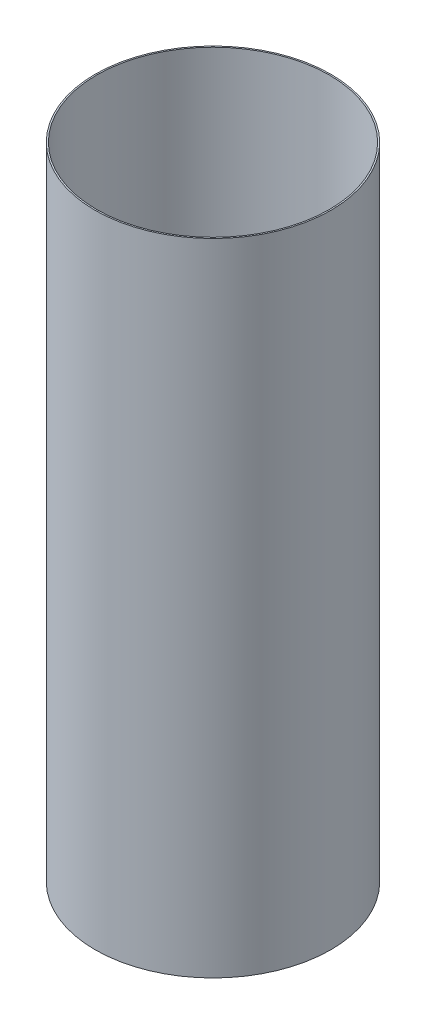
ISO-10303-21;
HEADER;
FILE_DESCRIPTION(('STEP AP214'),'2;1');
FILE_NAME('part.step','',(''),(''),'','','');
FILE_SCHEMA(('AUTOMOTIVE_DESIGN { 1 0 10303 214 1 1 1 1 }'));
ENDSEC;
DATA;
#1=APPLICATION_CONTEXT('core data for automotive mechanical design processes');
#2=APPLICATION_PROTOCOL_DEFINITION('international standard','automotive_design',2000,#1);
#3=PRODUCT_CONTEXT('',#1,'mechanical');
#4=PRODUCT('Part','Part','',(#3));
#5=PRODUCT_RELATED_PRODUCT_CATEGORY('part','',(#4));
#6=PRODUCT_DEFINITION_FORMATION('','',#4);
#7=PRODUCT_DEFINITION_CONTEXT('part definition',#1,'design');
#8=PRODUCT_DEFINITION('design','',#6,#7);
#9=PRODUCT_DEFINITION_SHAPE('','',#8);
#10=(LENGTH_UNIT() NAMED_UNIT(*) SI_UNIT(.MILLI.,.METRE.));
#11=(NAMED_UNIT(*) PLANE_ANGLE_UNIT() SI_UNIT($,.RADIAN.));
#12=(NAMED_UNIT(*) SI_UNIT($,.STERADIAN.) SOLID_ANGLE_UNIT());
#13=UNCERTAINTY_MEASURE_WITH_UNIT(LENGTH_MEASURE(1.E-05),#10,'distance_accuracy_value','');
#14=(GEOMETRIC_REPRESENTATION_CONTEXT(3) GLOBAL_UNCERTAINTY_ASSIGNED_CONTEXT((#13)) GLOBAL_UNIT_ASSIGNED_CONTEXT((#10,
#11,#12)) REPRESENTATION_CONTEXT('',''));
#15=CARTESIAN_POINT('',(0.,0.,0.));
#16=DIRECTION('',(0.,0.,1.));
#17=DIRECTION('',(1.,0.,0.));
#18=AXIS2_PLACEMENT_3D('',#15,#16,#17);
#19=CARTESIAN_POINT('',(0.,22000.,0.));
#20=DIRECTION('',(0.,1.,0.));
#21=DIRECTION('',(0.,0.,1.));
#22=AXIS2_PLACEMENT_3D('',#19,#20,#21);
#23=PLANE('',#22);
#24=CARTESIAN_POINT('',(0.,22000.,0.));
#25=DIRECTION('',(0.,1.,0.));
#26=DIRECTION('',(0.,0.,1.));
#27=AXIS2_PLACEMENT_3D('',#24,#25,#26);
#28=CIRCLE('',#27,4050.);
#29=CARTESIAN_POINT('',(0.,22000.,4050.));
#30=VERTEX_POINT('',#29);
#31=EDGE_CURVE('E10',#30,#30,#28,.T.);
#32=ORIENTED_EDGE('',*,*,#31,.T.);
#33=EDGE_LOOP('',(#32));
#34=FACE_BOUND('',#33,.T.);
#35=CARTESIAN_POINT('',(0.,22000.,0.));
#36=DIRECTION('',(0.,1.,0.));
#37=DIRECTION('',(0.,0.,1.));
#38=AXIS2_PLACEMENT_3D('',#35,#36,#37);
#39=CIRCLE('',#38,4000.);
#40=CARTESIAN_POINT('',(0.,22000.,4000.));
#41=VERTEX_POINT('',#40);
#42=EDGE_CURVE('E48',#41,#41,#39,.T.);
#43=ORIENTED_EDGE('',*,*,#42,.F.);
#44=EDGE_LOOP('',(#43));
#45=FACE_BOUND('',#44,.T.);
#46=ADVANCED_FACE('F40',(#34,#45),#23,.T.);
#47=CARTESIAN_POINT('',(0.,0.,0.));
#48=DIRECTION('',(0.,1.,0.));
#49=DIRECTION('',(0.,0.,1.));
#50=AXIS2_PLACEMENT_3D('',#47,#48,#49);
#51=PLANE('',#50);
#52=CARTESIAN_POINT('',(0.,0.,0.));
#53=DIRECTION('',(0.,1.,0.));
#54=DIRECTION('',(0.,0.,1.));
#55=AXIS2_PLACEMENT_3D('',#52,#53,#54);
#56=CIRCLE('',#55,4050.);
#57=CARTESIAN_POINT('',(0.,0.,4050.));
#58=VERTEX_POINT('',#57);
#59=EDGE_CURVE('E41',#58,#58,#56,.T.);
#60=ORIENTED_EDGE('',*,*,#59,.F.);
#61=EDGE_LOOP('',(#60));
#62=FACE_BOUND('',#61,.T.);
#63=CARTESIAN_POINT('',(0.,0.,0.));
#64=DIRECTION('',(0.,1.,0.));
#65=DIRECTION('',(0.,0.,1.));
#66=AXIS2_PLACEMENT_3D('',#63,#64,#65);
#67=CIRCLE('',#66,4000.);
#68=CARTESIAN_POINT('',(0.,0.,4000.));
#69=VERTEX_POINT('',#68);
#70=EDGE_CURVE('E49',#69,#69,#67,.T.);
#71=ORIENTED_EDGE('',*,*,#70,.T.);
#72=EDGE_LOOP('',(#71));
#73=FACE_BOUND('',#72,.T.);
#74=ADVANCED_FACE('F58',(#62,#73),#51,.F.);
#75=CARTESIAN_POINT('',(0.,22000.,0.));
#76=DIRECTION('',(0.,-1.,0.));
#77=DIRECTION('',(0.,0.,-1.));
#78=AXIS2_PLACEMENT_3D('',#75,#76,#77);
#79=CYLINDRICAL_SURFACE('',#78,4050.);
#80=ORIENTED_EDGE('',*,*,#31,.F.);
#81=EDGE_LOOP('',(#80));
#82=FACE_BOUND('',#81,.T.);
#83=ORIENTED_EDGE('',*,*,#59,.T.);
#84=EDGE_LOOP('',(#83));
#85=FACE_BOUND('',#84,.T.);
#86=ADVANCED_FACE('F39',(#82,#85),#79,.T.);
#87=CARTESIAN_POINT('',(0.,22000.,0.));
#88=DIRECTION('',(0.,-1.,0.));
#89=DIRECTION('',(0.,0.,-1.));
#90=AXIS2_PLACEMENT_3D('',#87,#88,#89);
#91=CYLINDRICAL_SURFACE('',#90,4000.);
#92=ORIENTED_EDGE('',*,*,#42,.T.);
#93=EDGE_LOOP('',(#92));
#94=FACE_BOUND('',#93,.T.);
#95=ORIENTED_EDGE('',*,*,#70,.F.);
#96=EDGE_LOOP('',(#95));
#97=FACE_BOUND('',#96,.T.);
#98=ADVANCED_FACE('F57',(#94,#97),#91,.F.);
#99=CLOSED_SHELL('',(#46,#74,#86,#98));
#100=MANIFOLD_SOLID_BREP('B2',#99);
#101=ADVANCED_BREP_SHAPE_REPRESENTATION('',(#18,#100),#14);
#102=SHAPE_DEFINITION_REPRESENTATION(#9,#101);
ENDSEC;
END-ISO-10303-21;
